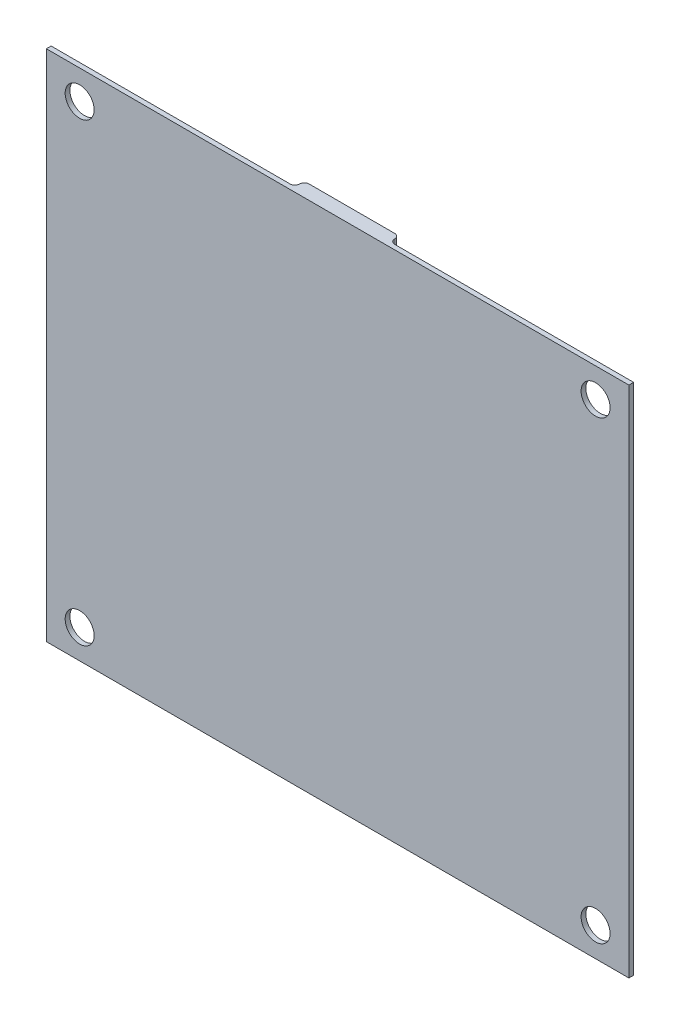
ISO-10303-21;
HEADER;
FILE_DESCRIPTION(('STEP AP214'),'2;1');
FILE_NAME('part.step','',(''),(''),'','','');
FILE_SCHEMA(('AUTOMOTIVE_DESIGN { 1 0 10303 214 1 1 1 1 }'));
ENDSEC;
DATA;
#1=APPLICATION_CONTEXT('core data for automotive mechanical design processes');
#2=APPLICATION_PROTOCOL_DEFINITION('international standard','automotive_design',2000,#1);
#3=PRODUCT_CONTEXT('',#1,'mechanical');
#4=PRODUCT('Part','Part','',(#3));
#5=PRODUCT_RELATED_PRODUCT_CATEGORY('part','',(#4));
#6=PRODUCT_DEFINITION_FORMATION('','',#4);
#7=PRODUCT_DEFINITION_CONTEXT('part definition',#1,'design');
#8=PRODUCT_DEFINITION('design','',#6,#7);
#9=PRODUCT_DEFINITION_SHAPE('','',#8);
#10=(LENGTH_UNIT() NAMED_UNIT(*) SI_UNIT(.MILLI.,.METRE.));
#11=(NAMED_UNIT(*) PLANE_ANGLE_UNIT() SI_UNIT($,.RADIAN.));
#12=(NAMED_UNIT(*) SI_UNIT($,.STERADIAN.) SOLID_ANGLE_UNIT());
#13=UNCERTAINTY_MEASURE_WITH_UNIT(LENGTH_MEASURE(1.E-05),#10,'distance_accuracy_value','');
#14=(GEOMETRIC_REPRESENTATION_CONTEXT(3) GLOBAL_UNCERTAINTY_ASSIGNED_CONTEXT((#13)) GLOBAL_UNIT_ASSIGNED_CONTEXT((#10,
#11,#12)) REPRESENTATION_CONTEXT('',''));
#15=CARTESIAN_POINT('',(0.,0.,0.));
#16=DIRECTION('',(0.,0.,1.));
#17=DIRECTION('',(1.,0.,0.));
#18=AXIS2_PLACEMENT_3D('',#15,#16,#17);
#19=CARTESIAN_POINT('',(0.,0.,0.));
#20=DIRECTION('',(0.,0.,1.));
#21=DIRECTION('',(1.,0.,0.));
#22=AXIS2_PLACEMENT_3D('',#19,#20,#21);
#23=PLANE('',#22);
#24=CARTESIAN_POINT('',(-108.504553773926,-269.266081741187,0.));
#25=DIRECTION('',(0.,0.,1.));
#26=DIRECTION('',(1.,0.,0.));
#27=AXIS2_PLACEMENT_3D('',#24,#25,#26);
#28=CIRCLE('',#27,6.09999999999999);
#29=CARTESIAN_POINT('',(-102.404553773926,-269.266081741187,0.));
#30=VERTEX_POINT('',#29);
#31=EDGE_CURVE('E150',#30,#30,#28,.T.);
#32=ORIENTED_EDGE('',*,*,#31,.T.);
#33=EDGE_LOOP('',(#32));
#34=FACE_BOUND('',#33,.T.);
#35=CARTESIAN_POINT('',(-108.504553773926,-77.749220728237,0.));
#36=DIRECTION('',(0.,0.,1.));
#37=DIRECTION('',(1.,0.,0.));
#38=AXIS2_PLACEMENT_3D('',#35,#36,#37);
#39=CIRCLE('',#38,6.09999999999999);
#40=CARTESIAN_POINT('',(-102.404553773926,-77.749220728237,0.));
#41=VERTEX_POINT('',#40);
#42=EDGE_CURVE('E160',#41,#41,#39,.T.);
#43=ORIENTED_EDGE('',*,*,#42,.T.);
#44=EDGE_LOOP('',(#43));
#45=FACE_BOUND('',#44,.T.);
#46=CARTESIAN_POINT('',(108.504553773926,-77.7492207282371,0.));
#47=DIRECTION('',(0.,0.,1.));
#48=DIRECTION('',(1.,0.,0.));
#49=AXIS2_PLACEMENT_3D('',#46,#47,#48);
#50=CIRCLE('',#49,6.09999999999999);
#51=CARTESIAN_POINT('',(114.604553773926,-77.7492207282371,0.));
#52=VERTEX_POINT('',#51);
#53=EDGE_CURVE('E165',#52,#52,#50,.T.);
#54=ORIENTED_EDGE('',*,*,#53,.T.);
#55=EDGE_LOOP('',(#54));
#56=FACE_BOUND('',#55,.T.);
#57=CARTESIAN_POINT('',(108.504553773926,-269.266081741187,0.));
#58=DIRECTION('',(0.,0.,1.));
#59=DIRECTION('',(1.,0.,0.));
#60=AXIS2_PLACEMENT_3D('',#57,#58,#59);
#61=CIRCLE('',#60,6.09999999999999);
#62=CARTESIAN_POINT('',(114.604553773926,-269.266081741187,0.));
#63=VERTEX_POINT('',#62);
#64=EDGE_CURVE('E171',#63,#63,#61,.T.);
#65=ORIENTED_EDGE('',*,*,#64,.T.);
#66=EDGE_LOOP('',(#65));
#67=FACE_BOUND('',#66,.T.);
#68=DIRECTION('',(-1.,0.,0.));
#69=VECTOR('',#68,1.);
#70=CARTESIAN_POINT('',(122.5,-65.5153024694245,0.));
#71=LINE('',#70,#69);
#72=CARTESIAN_POINT('',(-22.,-65.5153024694245,0.));
#73=VERTEX_POINT('',#72);
#74=CARTESIAN_POINT('',(-122.5,-65.5153024694245,0.));
#75=VERTEX_POINT('',#74);
#76=EDGE_CURVE('E116',#73,#75,#71,.T.);
#77=ORIENTED_EDGE('',*,*,#76,.F.);
#78=DIRECTION('',(0.,1.,0.));
#79=VECTOR('',#78,1.);
#80=CARTESIAN_POINT('',(-22.,-95.5153024694245,0.));
#81=LINE('',#80,#79);
#82=CARTESIAN_POINT('',(-22.,-97.5153024694245,0.));
#83=VERTEX_POINT('',#82);
#84=EDGE_CURVE('E52',#73,#83,#81,.F.);
#85=ORIENTED_EDGE('',*,*,#84,.T.);
#86=DIRECTION('',(-1.,0.,0.));
#87=VECTOR('',#86,1.);
#88=CARTESIAN_POINT('',(20.,-97.5153024694245,0.));
#89=LINE('',#88,#87);
#90=CARTESIAN_POINT('',(22.,-97.5153024694245,0.));
#91=VERTEX_POINT('',#90);
#92=EDGE_CURVE('E128',#83,#91,#89,.F.);
#93=ORIENTED_EDGE('',*,*,#92,.T.);
#94=DIRECTION('',(0.,-1.,0.));
#95=VECTOR('',#94,1.);
#96=CARTESIAN_POINT('',(22.,-65.5153024694245,0.));
#97=LINE('',#96,#95);
#98=CARTESIAN_POINT('',(22.,-65.5153024694245,0.));
#99=VERTEX_POINT('',#98);
#100=EDGE_CURVE('E130',#91,#99,#97,.F.);
#101=ORIENTED_EDGE('',*,*,#100,.T.);
#102=CARTESIAN_POINT('',(122.5,-65.5153024694245,0.));
#103=VERTEX_POINT('',#102);
#104=EDGE_CURVE('E125',#103,#99,#71,.T.);
#105=ORIENTED_EDGE('',*,*,#104,.F.);
#106=DIRECTION('',(0.,1.,0.));
#107=VECTOR('',#106,1.);
#108=CARTESIAN_POINT('',(122.5,-281.5,0.));
#109=LINE('',#108,#107);
#110=CARTESIAN_POINT('',(122.5,-281.5,0.));
#111=VERTEX_POINT('',#110);
#112=EDGE_CURVE('E77',#111,#103,#109,.T.);
#113=ORIENTED_EDGE('',*,*,#112,.F.);
#114=DIRECTION('',(1.,0.,0.));
#115=VECTOR('',#114,1.);
#116=CARTESIAN_POINT('',(-122.5,-281.5,0.));
#117=LINE('',#116,#115);
#118=CARTESIAN_POINT('',(-122.5,-281.5,0.));
#119=VERTEX_POINT('',#118);
#120=EDGE_CURVE('E177',#119,#111,#117,.T.);
#121=ORIENTED_EDGE('',*,*,#120,.F.);
#122=DIRECTION('',(0.,-1.,0.));
#123=VECTOR('',#122,1.);
#124=CARTESIAN_POINT('',(-122.5,-65.5153024694245,0.));
#125=LINE('',#124,#123);
#126=EDGE_CURVE('E124',#75,#119,#125,.T.);
#127=ORIENTED_EDGE('',*,*,#126,.F.);
#128=EDGE_LOOP('',(#77,#85,#93,#101,#105,#113,#121,#127));
#129=FACE_BOUND('',#128,.T.);
#130=ADVANCED_FACE('F33',(#34,#45,#56,#67,#129),#23,.F.);
#131=CARTESIAN_POINT('',(0.,0.,2.));
#132=DIRECTION('',(0.,0.,1.));
#133=DIRECTION('',(1.,0.,0.));
#134=AXIS2_PLACEMENT_3D('',#131,#132,#133);
#135=PLANE('',#134);
#136=CARTESIAN_POINT('',(-108.504553773926,-77.749220728237,2.));
#137=DIRECTION('',(0.,0.,1.));
#138=DIRECTION('',(1.,0.,0.));
#139=AXIS2_PLACEMENT_3D('',#136,#137,#138);
#140=CIRCLE('',#139,6.09999999999999);
#141=CARTESIAN_POINT('',(-102.404553773926,-77.749220728237,2.));
#142=VERTEX_POINT('',#141);
#143=EDGE_CURVE('E162',#142,#142,#140,.T.);
#144=ORIENTED_EDGE('',*,*,#143,.F.);
#145=EDGE_LOOP('',(#144));
#146=FACE_BOUND('',#145,.T.);
#147=CARTESIAN_POINT('',(108.504553773926,-269.266081741187,2.));
#148=DIRECTION('',(0.,0.,1.));
#149=DIRECTION('',(1.,0.,0.));
#150=AXIS2_PLACEMENT_3D('',#147,#148,#149);
#151=CIRCLE('',#150,6.09999999999999);
#152=CARTESIAN_POINT('',(114.604553773926,-269.266081741187,2.));
#153=VERTEX_POINT('',#152);
#154=EDGE_CURVE('E174',#153,#153,#151,.T.);
#155=ORIENTED_EDGE('',*,*,#154,.F.);
#156=EDGE_LOOP('',(#155));
#157=FACE_BOUND('',#156,.T.);
#158=DIRECTION('',(1.,0.,0.));
#159=VECTOR('',#158,1.);
#160=CARTESIAN_POINT('',(-122.5,-281.5,2.));
#161=LINE('',#160,#159);
#162=CARTESIAN_POINT('',(-122.5,-281.5,2.));
#163=VERTEX_POINT('',#162);
#164=CARTESIAN_POINT('',(122.5,-281.5,2.));
#165=VERTEX_POINT('',#164);
#166=EDGE_CURVE('E180',#163,#165,#161,.T.);
#167=ORIENTED_EDGE('',*,*,#166,.T.);
#168=DIRECTION('',(0.,1.,0.));
#169=VECTOR('',#168,1.);
#170=CARTESIAN_POINT('',(122.5,-281.5,2.));
#171=LINE('',#170,#169);
#172=CARTESIAN_POINT('',(122.5,-65.5153024694245,2.));
#173=VERTEX_POINT('',#172);
#174=EDGE_CURVE('E183',#165,#173,#171,.T.);
#175=ORIENTED_EDGE('',*,*,#174,.T.);
#176=DIRECTION('',(-1.,0.,0.));
#177=VECTOR('',#176,1.);
#178=CARTESIAN_POINT('',(122.5,-65.5153024694245,2.));
#179=LINE('',#178,#177);
#180=CARTESIAN_POINT('',(-122.5,-65.5153024694245,2.));
#181=VERTEX_POINT('',#180);
#182=EDGE_CURVE('E186',#173,#181,#179,.T.);
#183=ORIENTED_EDGE('',*,*,#182,.T.);
#184=DIRECTION('',(0.,-1.,0.));
#185=VECTOR('',#184,1.);
#186=CARTESIAN_POINT('',(-122.5,-65.5153024694245,2.));
#187=LINE('',#186,#185);
#188=EDGE_CURVE('E189',#181,#163,#187,.T.);
#189=ORIENTED_EDGE('',*,*,#188,.T.);
#190=EDGE_LOOP('',(#167,#175,#183,#189));
#191=FACE_BOUND('',#190,.T.);
#192=CARTESIAN_POINT('',(108.504553773926,-77.7492207282371,2.));
#193=DIRECTION('',(0.,0.,1.));
#194=DIRECTION('',(1.,0.,0.));
#195=AXIS2_PLACEMENT_3D('',#192,#193,#194);
#196=CIRCLE('',#195,6.09999999999999);
#197=CARTESIAN_POINT('',(114.604553773926,-77.7492207282371,2.));
#198=VERTEX_POINT('',#197);
#199=EDGE_CURVE('E168',#198,#198,#196,.T.);
#200=ORIENTED_EDGE('',*,*,#199,.F.);
#201=EDGE_LOOP('',(#200));
#202=FACE_BOUND('',#201,.T.);
#203=CARTESIAN_POINT('',(-108.504553773926,-269.266081741187,2.));
#204=DIRECTION('',(0.,0.,1.));
#205=DIRECTION('',(1.,0.,0.));
#206=AXIS2_PLACEMENT_3D('',#203,#204,#205);
#207=CIRCLE('',#206,6.09999999999999);
#208=CARTESIAN_POINT('',(-102.404553773926,-269.266081741187,2.));
#209=VERTEX_POINT('',#208);
#210=EDGE_CURVE('E156',#209,#209,#207,.T.);
#211=ORIENTED_EDGE('',*,*,#210,.F.);
#212=EDGE_LOOP('',(#211));
#213=FACE_BOUND('',#212,.T.);
#214=ADVANCED_FACE('F236',(#146,#157,#191,#202,#213),#135,.T.);
#215=CARTESIAN_POINT('',(-122.5,-281.5,2.));
#216=DIRECTION('',(0.,1.,0.));
#217=DIRECTION('',(0.,0.,1.));
#218=AXIS2_PLACEMENT_3D('',#215,#216,#217);
#219=PLANE('',#218);
#220=ORIENTED_EDGE('',*,*,#120,.T.);
#221=DIRECTION('',(0.,0.,-1.));
#222=VECTOR('',#221,1.);
#223=CARTESIAN_POINT('',(122.5,-281.5,2.));
#224=LINE('',#223,#222);
#225=EDGE_CURVE('E206',#165,#111,#224,.T.);
#226=ORIENTED_EDGE('',*,*,#225,.F.);
#227=ORIENTED_EDGE('',*,*,#166,.F.);
#228=DIRECTION('',(0.,0.,-1.));
#229=VECTOR('',#228,1.);
#230=CARTESIAN_POINT('',(-122.5,-281.5,2.));
#231=LINE('',#230,#229);
#232=EDGE_CURVE('E192',#163,#119,#231,.T.);
#233=ORIENTED_EDGE('',*,*,#232,.T.);
#234=EDGE_LOOP('',(#220,#226,#227,#233));
#235=FACE_BOUND('',#234,.T.);
#236=ADVANCED_FACE('F242',(#235),#219,.F.);
#237=CARTESIAN_POINT('',(122.5,-281.5,2.));
#238=DIRECTION('',(-1.,0.,0.));
#239=DIRECTION('',(0.,0.,1.));
#240=AXIS2_PLACEMENT_3D('',#237,#238,#239);
#241=PLANE('',#240);
#242=ORIENTED_EDGE('',*,*,#112,.T.);
#243=DIRECTION('',(0.,0.,-1.));
#244=VECTOR('',#243,1.);
#245=CARTESIAN_POINT('',(122.5,-65.5153024694245,2.));
#246=LINE('',#245,#244);
#247=EDGE_CURVE('E219',#173,#103,#246,.T.);
#248=ORIENTED_EDGE('',*,*,#247,.F.);
#249=ORIENTED_EDGE('',*,*,#174,.F.);
#250=ORIENTED_EDGE('',*,*,#225,.T.);
#251=EDGE_LOOP('',(#242,#248,#249,#250));
#252=FACE_BOUND('',#251,.T.);
#253=ADVANCED_FACE('F255',(#252),#241,.F.);
#254=CARTESIAN_POINT('',(122.5,-65.5153024694245,2.));
#255=DIRECTION('',(0.,-1.,0.));
#256=DIRECTION('',(1.,0.,0.));
#257=AXIS2_PLACEMENT_3D('',#254,#255,#256);
#258=PLANE('',#257);
#259=DIRECTION('',(1.,0.,0.));
#260=VECTOR('',#259,1.);
#261=CARTESIAN_POINT('',(20.,-65.5153024694245,-4.));
#262=LINE('',#261,#260);
#263=CARTESIAN_POINT('',(-18.,-65.5153024694245,-4.));
#264=VERTEX_POINT('',#263);
#265=CARTESIAN_POINT('',(18.,-65.5153024694245,-4.));
#266=VERTEX_POINT('',#265);
#267=EDGE_CURVE('E148',#264,#266,#262,.T.);
#268=ORIENTED_EDGE('',*,*,#267,.F.);
#269=CARTESIAN_POINT('',(-18.,-65.5153024694245,-2.));
#270=DIRECTION('',(0.,-1.,0.));
#271=DIRECTION('',(1.,0.,0.));
#272=AXIS2_PLACEMENT_3D('',#269,#270,#271);
#273=CIRCLE('',#272,2.);
#274=CARTESIAN_POINT('',(-20.,-65.5153024694245,-2.));
#275=VERTEX_POINT('',#274);
#276=EDGE_CURVE('E118',#264,#275,#273,.F.);
#277=ORIENTED_EDGE('',*,*,#276,.T.);
#278=CARTESIAN_POINT('',(-22.,-65.5153024694245,-2.));
#279=DIRECTION('',(0.,-1.,0.));
#280=DIRECTION('',(1.,0.,0.));
#281=AXIS2_PLACEMENT_3D('',#278,#279,#280);
#282=CIRCLE('',#281,2.);
#283=EDGE_CURVE('E43',#275,#73,#282,.T.);
#284=ORIENTED_EDGE('',*,*,#283,.T.);
#285=ORIENTED_EDGE('',*,*,#76,.T.);
#286=DIRECTION('',(0.,0.,-1.));
#287=VECTOR('',#286,1.);
#288=CARTESIAN_POINT('',(-122.5,-65.5153024694245,2.));
#289=LINE('',#288,#287);
#290=EDGE_CURVE('E267',#181,#75,#289,.T.);
#291=ORIENTED_EDGE('',*,*,#290,.F.);
#292=ORIENTED_EDGE('',*,*,#182,.F.);
#293=ORIENTED_EDGE('',*,*,#247,.T.);
#294=ORIENTED_EDGE('',*,*,#104,.T.);
#295=CARTESIAN_POINT('',(22.,-65.5153024694245,-2.));
#296=DIRECTION('',(0.,-1.,0.));
#297=DIRECTION('',(1.,0.,0.));
#298=AXIS2_PLACEMENT_3D('',#295,#296,#297);
#299=CIRCLE('',#298,2.);
#300=CARTESIAN_POINT('',(20.,-65.5153024694245,-2.));
#301=VERTEX_POINT('',#300);
#302=EDGE_CURVE('E11',#99,#301,#299,.T.);
#303=ORIENTED_EDGE('',*,*,#302,.T.);
#304=CARTESIAN_POINT('',(18.,-65.5153024694245,-2.));
#305=DIRECTION('',(0.,-1.,0.));
#306=DIRECTION('',(1.,0.,0.));
#307=AXIS2_PLACEMENT_3D('',#304,#305,#306);
#308=CIRCLE('',#307,2.);
#309=EDGE_CURVE('E212',#301,#266,#308,.F.);
#310=ORIENTED_EDGE('',*,*,#309,.T.);
#311=EDGE_LOOP('',(#268,#277,#284,#285,#291,#292,#293,#294,#303,#310));
#312=FACE_BOUND('',#311,.T.);
#313=ADVANCED_FACE('F114',(#312),#258,.F.);
#314=CARTESIAN_POINT('',(-122.5,-65.5153024694245,2.));
#315=DIRECTION('',(1.,0.,0.));
#316=DIRECTION('',(0.,0.,-1.));
#317=AXIS2_PLACEMENT_3D('',#314,#315,#316);
#318=PLANE('',#317);
#319=ORIENTED_EDGE('',*,*,#126,.T.);
#320=ORIENTED_EDGE('',*,*,#232,.F.);
#321=ORIENTED_EDGE('',*,*,#188,.F.);
#322=ORIENTED_EDGE('',*,*,#290,.T.);
#323=EDGE_LOOP('',(#319,#320,#321,#322));
#324=FACE_BOUND('',#323,.T.);
#325=ADVANCED_FACE('F248',(#324),#318,.F.);
#326=CARTESIAN_POINT('',(108.504553773926,-269.266081741187,2.));
#327=DIRECTION('',(0.,0.,-1.));
#328=DIRECTION('',(-1.,0.,0.));
#329=AXIS2_PLACEMENT_3D('',#326,#327,#328);
#330=CYLINDRICAL_SURFACE('',#329,6.09999999999999);
#331=ORIENTED_EDGE('',*,*,#154,.T.);
#332=EDGE_LOOP('',(#331));
#333=FACE_BOUND('',#332,.T.);
#334=ORIENTED_EDGE('',*,*,#64,.F.);
#335=EDGE_LOOP('',(#334));
#336=FACE_BOUND('',#335,.T.);
#337=ADVANCED_FACE('F251',(#333,#336),#330,.F.);
#338=CARTESIAN_POINT('',(108.504553773926,-77.7492207282371,2.));
#339=DIRECTION('',(0.,0.,-1.));
#340=DIRECTION('',(-1.,0.,0.));
#341=AXIS2_PLACEMENT_3D('',#338,#339,#340);
#342=CYLINDRICAL_SURFACE('',#341,6.09999999999999);
#343=ORIENTED_EDGE('',*,*,#199,.T.);
#344=EDGE_LOOP('',(#343));
#345=FACE_BOUND('',#344,.T.);
#346=ORIENTED_EDGE('',*,*,#53,.F.);
#347=EDGE_LOOP('',(#346));
#348=FACE_BOUND('',#347,.T.);
#349=ADVANCED_FACE('F291',(#345,#348),#342,.F.);
#350=CARTESIAN_POINT('',(-108.504553773926,-77.749220728237,2.));
#351=DIRECTION('',(0.,0.,-1.));
#352=DIRECTION('',(-1.,0.,0.));
#353=AXIS2_PLACEMENT_3D('',#350,#351,#352);
#354=CYLINDRICAL_SURFACE('',#353,6.09999999999999);
#355=ORIENTED_EDGE('',*,*,#143,.T.);
#356=EDGE_LOOP('',(#355));
#357=FACE_BOUND('',#356,.T.);
#358=ORIENTED_EDGE('',*,*,#42,.F.);
#359=EDGE_LOOP('',(#358));
#360=FACE_BOUND('',#359,.T.);
#361=ADVANCED_FACE('F283',(#357,#360),#354,.F.);
#362=CARTESIAN_POINT('',(-108.504553773926,-269.266081741187,2.));
#363=DIRECTION('',(0.,0.,-1.));
#364=DIRECTION('',(-1.,0.,0.));
#365=AXIS2_PLACEMENT_3D('',#362,#363,#364);
#366=CYLINDRICAL_SURFACE('',#365,6.09999999999999);
#367=ORIENTED_EDGE('',*,*,#210,.T.);
#368=EDGE_LOOP('',(#367));
#369=FACE_BOUND('',#368,.T.);
#370=ORIENTED_EDGE('',*,*,#31,.F.);
#371=EDGE_LOOP('',(#370));
#372=FACE_BOUND('',#371,.T.);
#373=ADVANCED_FACE('F280',(#369,#372),#366,.F.);
#374=CARTESIAN_POINT('',(0.,0.,-4.));
#375=DIRECTION('',(0.,0.,-1.));
#376=DIRECTION('',(-1.,0.,0.));
#377=AXIS2_PLACEMENT_3D('',#374,#375,#376);
#378=PLANE('',#377);
#379=DIRECTION('',(-1.,0.,0.));
#380=VECTOR('',#379,1.);
#381=CARTESIAN_POINT('',(-20.,-93.5153024694245,-4.));
#382=LINE('',#381,#380);
#383=CARTESIAN_POINT('',(18.,-93.5153024694245,-4.));
#384=VERTEX_POINT('',#383);
#385=CARTESIAN_POINT('',(-18.,-93.5153024694245,-4.));
#386=VERTEX_POINT('',#385);
#387=EDGE_CURVE('E210',#384,#386,#382,.T.);
#388=ORIENTED_EDGE('',*,*,#387,.T.);
#389=DIRECTION('',(0.,1.,0.));
#390=VECTOR('',#389,1.);
#391=CARTESIAN_POINT('',(-18.,-65.5153024694245,-4.));
#392=LINE('',#391,#390);
#393=EDGE_CURVE('E211',#386,#264,#392,.T.);
#394=ORIENTED_EDGE('',*,*,#393,.T.);
#395=ORIENTED_EDGE('',*,*,#267,.T.);
#396=DIRECTION('',(0.,-1.,0.));
#397=VECTOR('',#396,1.);
#398=CARTESIAN_POINT('',(18.,-95.5153024694245,-4.));
#399=LINE('',#398,#397);
#400=EDGE_CURVE('E208',#266,#384,#399,.T.);
#401=ORIENTED_EDGE('',*,*,#400,.T.);
#402=EDGE_LOOP('',(#388,#394,#395,#401));
#403=FACE_BOUND('',#402,.T.);
#404=ADVANCED_FACE('F222',(#403),#378,.T.);
#405=CARTESIAN_POINT('',(22.,-65.5153024694245,-2.));
#406=DIRECTION('',(0.,1.,0.));
#407=DIRECTION('',(-1.,0.,0.));
#408=AXIS2_PLACEMENT_3D('',#405,#406,#407);
#409=CYLINDRICAL_SURFACE('',#408,2.);
#410=ORIENTED_EDGE('',*,*,#302,.F.);
#411=ORIENTED_EDGE('',*,*,#100,.F.);
#412=CARTESIAN_POINT('',(22.,-97.5153024694245,-2.));
#413=DIRECTION('',(0.707106781186548,0.707106781186547,0.));
#414=DIRECTION('',(-0.707106781186547,0.707106781186548,0.));
#415=AXIS2_PLACEMENT_3D('',#412,#413,#414);
#416=ELLIPSE('',#415,2.82842712474619,2.);
#417=CARTESIAN_POINT('',(20.,-95.5153024694245,-2.));
#418=VERTEX_POINT('',#417);
#419=EDGE_CURVE('E37',#418,#91,#416,.T.);
#420=ORIENTED_EDGE('',*,*,#419,.F.);
#421=DIRECTION('',(0.,-1.,0.));
#422=VECTOR('',#421,1.);
#423=CARTESIAN_POINT('',(20.,-95.5153024694245,-2.));
#424=LINE('',#423,#422);
#425=EDGE_CURVE('E144',#301,#418,#424,.T.);
#426=ORIENTED_EDGE('',*,*,#425,.F.);
#427=EDGE_LOOP('',(#410,#411,#420,#426));
#428=FACE_BOUND('',#427,.T.);
#429=ADVANCED_FACE('F35',(#428),#409,.F.);
#430=CARTESIAN_POINT('',(20.,-97.5153024694245,-2.));
#431=DIRECTION('',(1.,0.,0.));
#432=DIRECTION('',(0.,0.,-1.));
#433=AXIS2_PLACEMENT_3D('',#430,#431,#432);
#434=CYLINDRICAL_SURFACE('',#433,2.);
#435=ORIENTED_EDGE('',*,*,#419,.T.);
#436=ORIENTED_EDGE('',*,*,#92,.F.);
#437=CARTESIAN_POINT('',(-22.,-97.5153024694245,-2.));
#438=DIRECTION('',(0.707106781186548,-0.707106781186547,0.));
#439=DIRECTION('',(0.707106781186547,0.707106781186548,0.));
#440=AXIS2_PLACEMENT_3D('',#437,#438,#439);
#441=ELLIPSE('',#440,2.82842712474619,2.);
#442=CARTESIAN_POINT('',(-20.,-95.5153024694245,-2.));
#443=VERTEX_POINT('',#442);
#444=EDGE_CURVE('E62',#443,#83,#441,.T.);
#445=ORIENTED_EDGE('',*,*,#444,.F.);
#446=DIRECTION('',(-1.,0.,0.));
#447=VECTOR('',#446,1.);
#448=CARTESIAN_POINT('',(-20.,-95.5153024694245,-2.));
#449=LINE('',#448,#447);
#450=EDGE_CURVE('E142',#418,#443,#449,.T.);
#451=ORIENTED_EDGE('',*,*,#450,.F.);
#452=EDGE_LOOP('',(#435,#436,#445,#451));
#453=FACE_BOUND('',#452,.T.);
#454=ADVANCED_FACE('F346',(#453),#434,.F.);
#455=CARTESIAN_POINT('',(18.,0.,-2.));
#456=DIRECTION('',(0.,1.,0.));
#457=DIRECTION('',(-1.,0.,0.));
#458=AXIS2_PLACEMENT_3D('',#455,#456,#457);
#459=CYLINDRICAL_SURFACE('',#458,2.);
#460=ORIENTED_EDGE('',*,*,#309,.F.);
#461=ORIENTED_EDGE('',*,*,#425,.T.);
#462=CARTESIAN_POINT('',(18.,-93.5153024694245,-2.));
#463=DIRECTION('',(0.707106781186548,0.707106781186547,0.));
#464=DIRECTION('',(-0.707106781186547,0.707106781186548,0.));
#465=AXIS2_PLACEMENT_3D('',#462,#463,#464);
#466=ELLIPSE('',#465,2.82842712474619,2.);
#467=EDGE_CURVE('E139',#384,#418,#466,.F.);
#468=ORIENTED_EDGE('',*,*,#467,.F.);
#469=ORIENTED_EDGE('',*,*,#400,.F.);
#470=EDGE_LOOP('',(#460,#461,#468,#469));
#471=FACE_BOUND('',#470,.T.);
#472=ADVANCED_FACE('F220',(#471),#459,.T.);
#473=CARTESIAN_POINT('',(-22.,-65.5153024694245,-2.));
#474=DIRECTION('',(0.,-1.,0.));
#475=DIRECTION('',(1.,0.,0.));
#476=AXIS2_PLACEMENT_3D('',#473,#474,#475);
#477=CYLINDRICAL_SURFACE('',#476,2.);
#478=ORIENTED_EDGE('',*,*,#84,.F.);
#479=ORIENTED_EDGE('',*,*,#283,.F.);
#480=DIRECTION('',(0.,1.,0.));
#481=VECTOR('',#480,1.);
#482=CARTESIAN_POINT('',(-20.,-65.5153024694245,-2.));
#483=LINE('',#482,#481);
#484=EDGE_CURVE('E137',#443,#275,#483,.T.);
#485=ORIENTED_EDGE('',*,*,#484,.F.);
#486=ORIENTED_EDGE('',*,*,#444,.T.);
#487=EDGE_LOOP('',(#478,#479,#485,#486));
#488=FACE_BOUND('',#487,.T.);
#489=ADVANCED_FACE('F127',(#488),#477,.F.);
#490=CARTESIAN_POINT('',(0.,-93.5153024694245,-2.));
#491=DIRECTION('',(1.,0.,0.));
#492=DIRECTION('',(0.,0.,-1.));
#493=AXIS2_PLACEMENT_3D('',#490,#491,#492);
#494=CYLINDRICAL_SURFACE('',#493,2.);
#495=ORIENTED_EDGE('',*,*,#467,.T.);
#496=ORIENTED_EDGE('',*,*,#450,.T.);
#497=CARTESIAN_POINT('',(-18.,-93.5153024694245,-2.));
#498=DIRECTION('',(0.707106781186548,-0.707106781186547,0.));
#499=DIRECTION('',(0.707106781186547,0.707106781186548,0.));
#500=AXIS2_PLACEMENT_3D('',#497,#498,#499);
#501=ELLIPSE('',#500,2.82842712474619,2.);
#502=EDGE_CURVE('E134',#386,#443,#501,.F.);
#503=ORIENTED_EDGE('',*,*,#502,.F.);
#504=ORIENTED_EDGE('',*,*,#387,.F.);
#505=EDGE_LOOP('',(#495,#496,#503,#504));
#506=FACE_BOUND('',#505,.T.);
#507=ADVANCED_FACE('F225',(#506),#494,.T.);
#508=CARTESIAN_POINT('',(-18.,0.,-2.));
#509=DIRECTION('',(0.,-1.,0.));
#510=DIRECTION('',(1.,0.,0.));
#511=AXIS2_PLACEMENT_3D('',#508,#509,#510);
#512=CYLINDRICAL_SURFACE('',#511,2.);
#513=ORIENTED_EDGE('',*,*,#502,.T.);
#514=ORIENTED_EDGE('',*,*,#484,.T.);
#515=ORIENTED_EDGE('',*,*,#276,.F.);
#516=ORIENTED_EDGE('',*,*,#393,.F.);
#517=EDGE_LOOP('',(#513,#514,#515,#516));
#518=FACE_BOUND('',#517,.T.);
#519=ADVANCED_FACE('F227',(#518),#512,.T.);
#520=CLOSED_SHELL('',(#130,#214,#236,#253,#313,#325,#337,#349,#361,#373,#404,#429,#454,#472,
#489,#507,#519));
#521=MANIFOLD_SOLID_BREP('B2',#520);
#522=ADVANCED_BREP_SHAPE_REPRESENTATION('',(#18,#521),#14);
#523=SHAPE_DEFINITION_REPRESENTATION(#9,#522);
ENDSEC;
END-ISO-10303-21;
